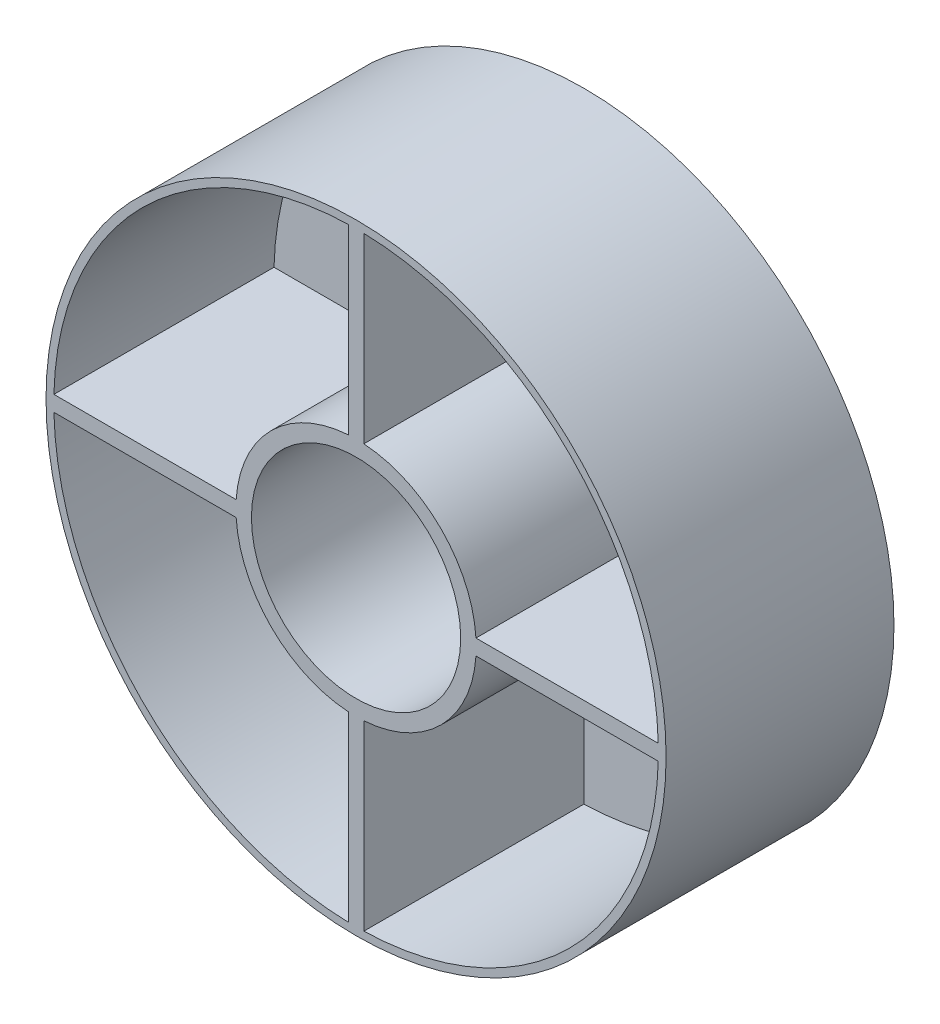
ISO-10303-21;
HEADER;
FILE_DESCRIPTION(('STEP AP214'),'2;1');
FILE_NAME('part.step','',(''),(''),'','','');
FILE_SCHEMA(('AUTOMOTIVE_DESIGN { 1 0 10303 214 1 1 1 1 }'));
ENDSEC;
DATA;
#1=APPLICATION_CONTEXT('core data for automotive mechanical design processes');
#2=APPLICATION_PROTOCOL_DEFINITION('international standard','automotive_design',2000,#1);
#3=PRODUCT_CONTEXT('',#1,'mechanical');
#4=PRODUCT('Part','Part','',(#3));
#5=PRODUCT_RELATED_PRODUCT_CATEGORY('part','',(#4));
#6=PRODUCT_DEFINITION_FORMATION('','',#4);
#7=PRODUCT_DEFINITION_CONTEXT('part definition',#1,'design');
#8=PRODUCT_DEFINITION('design','',#6,#7);
#9=PRODUCT_DEFINITION_SHAPE('','',#8);
#10=(LENGTH_UNIT() NAMED_UNIT(*) SI_UNIT(.MILLI.,.METRE.));
#11=(NAMED_UNIT(*) PLANE_ANGLE_UNIT() SI_UNIT($,.RADIAN.));
#12=(NAMED_UNIT(*) SI_UNIT($,.STERADIAN.) SOLID_ANGLE_UNIT());
#13=UNCERTAINTY_MEASURE_WITH_UNIT(LENGTH_MEASURE(1.E-05),#10,'distance_accuracy_value','');
#14=(GEOMETRIC_REPRESENTATION_CONTEXT(3) GLOBAL_UNCERTAINTY_ASSIGNED_CONTEXT((#13)) GLOBAL_UNIT_ASSIGNED_CONTEXT((#10,
#11,#12)) REPRESENTATION_CONTEXT('',''));
#15=CARTESIAN_POINT('',(0.,0.,0.));
#16=DIRECTION('',(0.,0.,1.));
#17=DIRECTION('',(1.,0.,0.));
#18=AXIS2_PLACEMENT_3D('',#15,#16,#17);
#19=CARTESIAN_POINT('',(0.,0.,5.));
#20=DIRECTION('',(0.,0.,1.));
#21=DIRECTION('',(1.,0.,0.));
#22=AXIS2_PLACEMENT_3D('',#19,#20,#21);
#23=PLANE('',#22);
#24=CARTESIAN_POINT('',(0.,0.,5.));
#25=DIRECTION('',(0.,0.,1.));
#26=DIRECTION('',(1.,0.,0.));
#27=AXIS2_PLACEMENT_3D('',#24,#25,#26);
#28=CIRCLE('',#27,25.);
#29=CARTESIAN_POINT('',(25.,0.,5.));
#30=VERTEX_POINT('',#29);
#31=EDGE_CURVE('E224',#30,#30,#28,.T.);
#32=ORIENTED_EDGE('',*,*,#31,.F.);
#33=EDGE_LOOP('',(#32));
#34=FACE_BOUND('',#33,.T.);
#35=CARTESIAN_POINT('',(0.,0.,5.));
#36=DIRECTION('',(0.,0.,1.));
#37=DIRECTION('',(1.,0.,0.));
#38=AXIS2_PLACEMENT_3D('',#35,#36,#37);
#39=CIRCLE('',#38,57.5);
#40=CARTESIAN_POINT('',(-57.5,0.,5.));
#41=VERTEX_POINT('',#40);
#42=EDGE_CURVE('E12',#41,#41,#39,.F.);
#43=ORIENTED_EDGE('',*,*,#42,.F.);
#44=EDGE_LOOP('',(#43));
#45=FACE_BOUND('',#44,.T.);
#46=ADVANCED_FACE('F45',(#34,#45),#23,.T.);
#47=CARTESIAN_POINT('',(0.,0.,147.));
#48=DIRECTION('',(0.,0.,-1.));
#49=DIRECTION('',(-1.,0.,0.));
#50=AXIS2_PLACEMENT_3D('',#47,#48,#49);
#51=CYLINDRICAL_SURFACE('',#50,77.5);
#52=DIRECTION('',(0.,0.,-1.));
#53=VECTOR('',#52,1.);
#54=CARTESIAN_POINT('',(77.3385414912901,5.,147.));
#55=LINE('',#54,#53);
#56=CARTESIAN_POINT('',(77.3385414912901,5.,5.));
#57=VERTEX_POINT('',#56);
#58=CARTESIAN_POINT('',(77.3385414912901,5.,147.));
#59=VERTEX_POINT('',#58);
#60=EDGE_CURVE('E60',#57,#59,#55,.F.);
#61=ORIENTED_EDGE('',*,*,#60,.F.);
#62=CARTESIAN_POINT('',(0.,0.,5.));
#63=DIRECTION('',(0.,0.,1.));
#64=DIRECTION('',(1.,0.,0.));
#65=AXIS2_PLACEMENT_3D('',#62,#63,#64);
#66=CIRCLE('',#65,77.5);
#67=CARTESIAN_POINT('',(5.,77.3385414912901,5.));
#68=VERTEX_POINT('',#67);
#69=EDGE_CURVE('E381',#57,#68,#66,.T.);
#70=ORIENTED_EDGE('',*,*,#69,.T.);
#71=DIRECTION('',(0.,0.,-1.));
#72=VECTOR('',#71,1.);
#73=CARTESIAN_POINT('',(5.,77.3385414912901,147.));
#74=LINE('',#73,#72);
#75=CARTESIAN_POINT('',(5.,77.3385414912901,147.));
#76=VERTEX_POINT('',#75);
#77=EDGE_CURVE('E295',#68,#76,#74,.F.);
#78=ORIENTED_EDGE('',*,*,#77,.T.);
#79=CARTESIAN_POINT('',(0.,0.,147.));
#80=DIRECTION('',(0.,0.,1.));
#81=DIRECTION('',(1.,0.,0.));
#82=AXIS2_PLACEMENT_3D('',#79,#80,#81);
#83=CIRCLE('',#82,77.5);
#84=EDGE_CURVE('E227',#59,#76,#83,.T.);
#85=ORIENTED_EDGE('',*,*,#84,.F.);
#86=EDGE_LOOP('',(#61,#70,#78,#85));
#87=FACE_BOUND('',#86,.T.);
#88=ADVANCED_FACE('F405',(#87),#51,.T.);
#89=CARTESIAN_POINT('',(0.,0.,5.));
#90=DIRECTION('',(0.,0.,1.));
#91=DIRECTION('',(1.,0.,0.));
#92=AXIS2_PLACEMENT_3D('',#89,#90,#91);
#93=PLANE('',#92);
#94=ORIENTED_EDGE('',*,*,#69,.F.);
#95=DIRECTION('',(1.,0.,0.));
#96=VECTOR('',#95,1.);
#97=CARTESIAN_POINT('',(0.,5.,5.));
#98=LINE('',#97,#96);
#99=CARTESIAN_POINT('',(194.935886896179,5.,5.));
#100=VERTEX_POINT('',#99);
#101=EDGE_CURVE('E260',#57,#100,#98,.T.);
#102=ORIENTED_EDGE('',*,*,#101,.T.);
#103=CARTESIAN_POINT('',(0.,0.,5.));
#104=DIRECTION('',(0.,0.,1.));
#105=DIRECTION('',(1.,0.,0.));
#106=AXIS2_PLACEMENT_3D('',#103,#104,#105);
#107=CIRCLE('',#106,195.);
#108=CARTESIAN_POINT('',(5.,194.935886896179,5.));
#109=VERTEX_POINT('',#108);
#110=EDGE_CURVE('E378',#109,#100,#107,.F.);
#111=ORIENTED_EDGE('',*,*,#110,.F.);
#112=DIRECTION('',(0.,1.,0.));
#113=VECTOR('',#112,1.);
#114=CARTESIAN_POINT('',(5.,0.,5.));
#115=LINE('',#114,#113);
#116=EDGE_CURVE('E218',#68,#109,#115,.T.);
#117=ORIENTED_EDGE('',*,*,#116,.F.);
#118=EDGE_LOOP('',(#94,#102,#111,#117));
#119=FACE_BOUND('',#118,.T.);
#120=ADVANCED_FACE('F402',(#119),#93,.T.);
#121=CARTESIAN_POINT('',(0.,0.,147.));
#122=DIRECTION('',(0.,0.,-1.));
#123=DIRECTION('',(-1.,0.,0.));
#124=AXIS2_PLACEMENT_3D('',#121,#122,#123);
#125=CYLINDRICAL_SURFACE('',#124,195.);
#126=CARTESIAN_POINT('',(0.,0.,147.));
#127=DIRECTION('',(0.,0.,1.));
#128=DIRECTION('',(1.,0.,0.));
#129=AXIS2_PLACEMENT_3D('',#126,#127,#128);
#130=CIRCLE('',#129,195.);
#131=CARTESIAN_POINT('',(5.,-194.935886896179,147.));
#132=VERTEX_POINT('',#131);
#133=CARTESIAN_POINT('',(194.935886896179,-5.,147.));
#134=VERTEX_POINT('',#133);
#135=EDGE_CURVE('E372',#132,#134,#130,.T.);
#136=ORIENTED_EDGE('',*,*,#135,.T.);
#137=DIRECTION('',(0.,0.,-1.));
#138=VECTOR('',#137,1.);
#139=CARTESIAN_POINT('',(194.935886896179,-5.,147.));
#140=LINE('',#139,#138);
#141=CARTESIAN_POINT('',(194.935886896179,-5.,5.));
#142=VERTEX_POINT('',#141);
#143=EDGE_CURVE('E250',#134,#142,#140,.T.);
#144=ORIENTED_EDGE('',*,*,#143,.T.);
#145=CARTESIAN_POINT('',(5.,-194.935886896179,5.));
#146=VERTEX_POINT('',#145);
#147=EDGE_CURVE('E382',#142,#146,#107,.F.);
#148=ORIENTED_EDGE('',*,*,#147,.T.);
#149=DIRECTION('',(0.,0.,-1.));
#150=VECTOR('',#149,1.);
#151=CARTESIAN_POINT('',(5.,-194.935886896179,147.));
#152=LINE('',#151,#150);
#153=EDGE_CURVE('E435',#132,#146,#152,.T.);
#154=ORIENTED_EDGE('',*,*,#153,.F.);
#155=EDGE_LOOP('',(#136,#144,#148,#154));
#156=FACE_BOUND('',#155,.T.);
#157=ADVANCED_FACE('F495',(#156),#125,.F.);
#158=CARTESIAN_POINT('',(-5.,194.935886896179,147.));
#159=VERTEX_POINT('',#158);
#160=CARTESIAN_POINT('',(-194.935886896179,5.,147.));
#161=VERTEX_POINT('',#160);
#162=EDGE_CURVE('E203',#159,#161,#130,.T.);
#163=ORIENTED_EDGE('',*,*,#162,.T.);
#164=DIRECTION('',(0.,0.,-1.));
#165=VECTOR('',#164,1.);
#166=CARTESIAN_POINT('',(-194.935886896179,5.,147.));
#167=LINE('',#166,#165);
#168=CARTESIAN_POINT('',(-194.935886896179,5.,5.));
#169=VERTEX_POINT('',#168);
#170=EDGE_CURVE('E273',#161,#169,#167,.T.);
#171=ORIENTED_EDGE('',*,*,#170,.T.);
#172=CARTESIAN_POINT('',(-5.,194.935886896179,5.));
#173=VERTEX_POINT('',#172);
#174=EDGE_CURVE('E375',#169,#173,#107,.F.);
#175=ORIENTED_EDGE('',*,*,#174,.T.);
#176=DIRECTION('',(0.,0.,-1.));
#177=VECTOR('',#176,1.);
#178=CARTESIAN_POINT('',(-5.,194.935886896179,147.));
#179=LINE('',#178,#177);
#180=EDGE_CURVE('E298',#173,#159,#179,.F.);
#181=ORIENTED_EDGE('',*,*,#180,.T.);
#182=EDGE_LOOP('',(#163,#171,#175,#181));
#183=FACE_BOUND('',#182,.T.);
#184=ADVANCED_FACE('F500',(#183),#125,.F.);
#185=DIRECTION('',(0.,0.,-1.));
#186=VECTOR('',#185,1.);
#187=CARTESIAN_POINT('',(-77.3385414912901,-5.,147.));
#188=LINE('',#187,#186);
#189=CARTESIAN_POINT('',(-77.3385414912901,-5.,5.));
#190=VERTEX_POINT('',#189);
#191=CARTESIAN_POINT('',(-77.3385414912901,-5.,147.));
#192=VERTEX_POINT('',#191);
#193=EDGE_CURVE('E270',#190,#192,#188,.F.);
#194=ORIENTED_EDGE('',*,*,#193,.F.);
#195=CARTESIAN_POINT('',(-5.,-77.3385414912901,5.));
#196=VERTEX_POINT('',#195);
#197=EDGE_CURVE('E385',#190,#196,#66,.T.);
#198=ORIENTED_EDGE('',*,*,#197,.T.);
#199=DIRECTION('',(0.,0.,-1.));
#200=VECTOR('',#199,1.);
#201=CARTESIAN_POINT('',(-5.,-77.3385414912901,147.));
#202=LINE('',#201,#200);
#203=CARTESIAN_POINT('',(-5.,-77.3385414912901,147.));
#204=VERTEX_POINT('',#203);
#205=EDGE_CURVE('E280',#196,#204,#202,.F.);
#206=ORIENTED_EDGE('',*,*,#205,.T.);
#207=EDGE_CURVE('E225',#192,#204,#83,.T.);
#208=ORIENTED_EDGE('',*,*,#207,.F.);
#209=EDGE_LOOP('',(#194,#198,#206,#208));
#210=FACE_BOUND('',#209,.T.);
#211=ADVANCED_FACE('F413',(#210),#51,.T.);
#212=ORIENTED_EDGE('',*,*,#197,.F.);
#213=DIRECTION('',(1.,0.,0.));
#214=VECTOR('',#213,1.);
#215=CARTESIAN_POINT('',(0.,-5.,5.));
#216=LINE('',#215,#214);
#217=CARTESIAN_POINT('',(-194.935886896179,-5.,5.));
#218=VERTEX_POINT('',#217);
#219=EDGE_CURVE('E431',#218,#190,#216,.T.);
#220=ORIENTED_EDGE('',*,*,#219,.F.);
#221=CARTESIAN_POINT('',(-5.,-194.935886896179,5.));
#222=VERTEX_POINT('',#221);
#223=EDGE_CURVE('E383',#222,#218,#107,.F.);
#224=ORIENTED_EDGE('',*,*,#223,.F.);
#225=DIRECTION('',(0.,1.,0.));
#226=VECTOR('',#225,1.);
#227=CARTESIAN_POINT('',(-5.,0.,5.));
#228=LINE('',#227,#226);
#229=EDGE_CURVE('E208',#222,#196,#228,.T.);
#230=ORIENTED_EDGE('',*,*,#229,.T.);
#231=EDGE_LOOP('',(#212,#220,#224,#230));
#232=FACE_BOUND('',#231,.T.);
#233=ADVANCED_FACE('F507',(#232),#93,.T.);
#234=CARTESIAN_POINT('',(5.,-77.3385414912901,5.));
#235=VERTEX_POINT('',#234);
#236=CARTESIAN_POINT('',(77.3385414912901,-5.,5.));
#237=VERTEX_POINT('',#236);
#238=EDGE_CURVE('E386',#235,#237,#66,.T.);
#239=ORIENTED_EDGE('',*,*,#238,.T.);
#240=DIRECTION('',(0.,0.,-1.));
#241=VECTOR('',#240,1.);
#242=CARTESIAN_POINT('',(77.3385414912901,-5.,147.));
#243=LINE('',#242,#241);
#244=CARTESIAN_POINT('',(77.3385414912901,-5.,147.));
#245=VERTEX_POINT('',#244);
#246=EDGE_CURVE('E249',#237,#245,#243,.F.);
#247=ORIENTED_EDGE('',*,*,#246,.T.);
#248=CARTESIAN_POINT('',(5.,-77.3385414912901,147.));
#249=VERTEX_POINT('',#248);
#250=EDGE_CURVE('E228',#249,#245,#83,.T.);
#251=ORIENTED_EDGE('',*,*,#250,.F.);
#252=DIRECTION('',(0.,0.,-1.));
#253=VECTOR('',#252,1.);
#254=CARTESIAN_POINT('',(5.,-77.3385414912901,147.));
#255=LINE('',#254,#253);
#256=EDGE_CURVE('E288',#235,#249,#255,.F.);
#257=ORIENTED_EDGE('',*,*,#256,.F.);
#258=EDGE_LOOP('',(#239,#247,#251,#257));
#259=FACE_BOUND('',#258,.T.);
#260=ADVANCED_FACE('F406',(#259),#51,.T.);
#261=DIRECTION('',(-1.,0.,0.));
#262=VECTOR('',#261,1.);
#263=CARTESIAN_POINT('',(0.,-5.,5.));
#264=LINE('',#263,#262);
#265=EDGE_CURVE('E68',#142,#237,#264,.T.);
#266=ORIENTED_EDGE('',*,*,#265,.T.);
#267=ORIENTED_EDGE('',*,*,#238,.F.);
#268=DIRECTION('',(0.,-1.,0.));
#269=VECTOR('',#268,1.);
#270=CARTESIAN_POINT('',(5.,0.,5.));
#271=LINE('',#270,#269);
#272=EDGE_CURVE('E285',#235,#146,#271,.T.);
#273=ORIENTED_EDGE('',*,*,#272,.T.);
#274=ORIENTED_EDGE('',*,*,#147,.F.);
#275=EDGE_LOOP('',(#266,#267,#273,#274));
#276=FACE_BOUND('',#275,.T.);
#277=ADVANCED_FACE('F403',(#276),#93,.T.);
#278=DIRECTION('',(0.,0.,-1.));
#279=VECTOR('',#278,1.);
#280=CARTESIAN_POINT('',(-194.935886896179,-5.,147.));
#281=LINE('',#280,#279);
#282=CARTESIAN_POINT('',(-194.935886896179,-5.,147.));
#283=VERTEX_POINT('',#282);
#284=EDGE_CURVE('E275',#283,#218,#281,.T.);
#285=ORIENTED_EDGE('',*,*,#284,.F.);
#286=CARTESIAN_POINT('',(-5.,-194.935886896179,147.));
#287=VERTEX_POINT('',#286);
#288=EDGE_CURVE('E370',#283,#287,#130,.T.);
#289=ORIENTED_EDGE('',*,*,#288,.T.);
#290=DIRECTION('',(0.,0.,-1.));
#291=VECTOR('',#290,1.);
#292=CARTESIAN_POINT('',(-5.,-194.935886896179,147.));
#293=LINE('',#292,#291);
#294=EDGE_CURVE('E230',#287,#222,#293,.T.);
#295=ORIENTED_EDGE('',*,*,#294,.T.);
#296=ORIENTED_EDGE('',*,*,#223,.T.);
#297=EDGE_LOOP('',(#285,#289,#295,#296));
#298=FACE_BOUND('',#297,.T.);
#299=ADVANCED_FACE('F422',(#298),#125,.F.);
#300=CARTESIAN_POINT('',(0.,0.,0.));
#301=DIRECTION('',(0.,0.,1.));
#302=DIRECTION('',(1.,0.,0.));
#303=AXIS2_PLACEMENT_3D('',#300,#301,#302);
#304=PLANE('',#303);
#305=CARTESIAN_POINT('',(0.,0.,0.));
#306=DIRECTION('',(0.,0.,-1.));
#307=DIRECTION('',(-1.,0.,0.));
#308=AXIS2_PLACEMENT_3D('',#305,#306,#307);
#309=CIRCLE('',#308,6.119);
#310=CARTESIAN_POINT('',(-6.119,0.,0.));
#311=VERTEX_POINT('',#310);
#312=EDGE_CURVE('E304',#311,#311,#309,.T.);
#313=ORIENTED_EDGE('',*,*,#312,.F.);
#314=EDGE_LOOP('',(#313));
#315=FACE_BOUND('',#314,.T.);
#316=CARTESIAN_POINT('',(0.,0.,0.));
#317=DIRECTION('',(0.,0.,1.));
#318=DIRECTION('',(1.,0.,0.));
#319=AXIS2_PLACEMENT_3D('',#316,#317,#318);
#320=CIRCLE('',#319,200.);
#321=CARTESIAN_POINT('',(200.,0.,0.));
#322=VERTEX_POINT('',#321);
#323=EDGE_CURVE('E367',#322,#322,#320,.T.);
#324=ORIENTED_EDGE('',*,*,#323,.F.);
#325=EDGE_LOOP('',(#324));
#326=FACE_BOUND('',#325,.T.);
#327=ADVANCED_FACE('F47',(#315,#326),#304,.F.);
#328=CARTESIAN_POINT('',(0.,0.,147.));
#329=DIRECTION('',(0.,0.,-1.));
#330=DIRECTION('',(-1.,0.,0.));
#331=AXIS2_PLACEMENT_3D('',#328,#329,#330);
#332=CYLINDRICAL_SURFACE('',#331,67.5);
#333=CARTESIAN_POINT('',(0.,0.,34.));
#334=DIRECTION('',(0.,0.,1.));
#335=DIRECTION('',(1.,0.,0.));
#336=AXIS2_PLACEMENT_3D('',#333,#334,#335);
#337=CIRCLE('',#336,67.5);
#338=CARTESIAN_POINT('',(67.5,0.,34.));
#339=VERTEX_POINT('',#338);
#340=EDGE_CURVE('E53',#339,#339,#337,.T.);
#341=ORIENTED_EDGE('',*,*,#340,.F.);
#342=EDGE_LOOP('',(#341));
#343=FACE_BOUND('',#342,.T.);
#344=CARTESIAN_POINT('',(0.,0.,147.));
#345=DIRECTION('',(0.,0.,1.));
#346=DIRECTION('',(1.,0.,0.));
#347=AXIS2_PLACEMENT_3D('',#344,#345,#346);
#348=CIRCLE('',#347,67.5);
#349=CARTESIAN_POINT('',(67.5,0.,147.));
#350=VERTEX_POINT('',#349);
#351=EDGE_CURVE('E233',#350,#350,#348,.T.);
#352=ORIENTED_EDGE('',*,*,#351,.T.);
#353=EDGE_LOOP('',(#352));
#354=FACE_BOUND('',#353,.T.);
#355=ADVANCED_FACE('F390',(#343,#354),#332,.F.);
#356=CARTESIAN_POINT('',(-5.,77.3385414912901,5.));
#357=VERTEX_POINT('',#356);
#358=CARTESIAN_POINT('',(-77.3385414912901,5.,5.));
#359=VERTEX_POINT('',#358);
#360=EDGE_CURVE('E384',#357,#359,#66,.T.);
#361=ORIENTED_EDGE('',*,*,#360,.T.);
#362=DIRECTION('',(0.,0.,-1.));
#363=VECTOR('',#362,1.);
#364=CARTESIAN_POINT('',(-77.3385414912901,5.,147.));
#365=LINE('',#364,#363);
#366=CARTESIAN_POINT('',(-77.3385414912901,5.,147.));
#367=VERTEX_POINT('',#366);
#368=EDGE_CURVE('E223',#359,#367,#365,.F.);
#369=ORIENTED_EDGE('',*,*,#368,.T.);
#370=CARTESIAN_POINT('',(-5.,77.3385414912901,147.));
#371=VERTEX_POINT('',#370);
#372=EDGE_CURVE('E202',#371,#367,#83,.T.);
#373=ORIENTED_EDGE('',*,*,#372,.F.);
#374=DIRECTION('',(0.,0.,-1.));
#375=VECTOR('',#374,1.);
#376=CARTESIAN_POINT('',(-5.,77.3385414912901,147.));
#377=LINE('',#376,#375);
#378=EDGE_CURVE('E211',#357,#371,#377,.F.);
#379=ORIENTED_EDGE('',*,*,#378,.F.);
#380=EDGE_LOOP('',(#361,#369,#373,#379));
#381=FACE_BOUND('',#380,.T.);
#382=ADVANCED_FACE('F221',(#381),#51,.T.);
#383=CARTESIAN_POINT('',(0.,0.,147.));
#384=DIRECTION('',(0.,0.,1.));
#385=DIRECTION('',(1.,0.,0.));
#386=AXIS2_PLACEMENT_3D('',#383,#384,#385);
#387=PLANE('',#386);
#388=CARTESIAN_POINT('',(194.935886896179,5.,147.));
#389=VERTEX_POINT('',#388);
#390=CARTESIAN_POINT('',(5.,194.935886896179,147.));
#391=VERTEX_POINT('',#390);
#392=EDGE_CURVE('E371',#389,#391,#130,.T.);
#393=ORIENTED_EDGE('',*,*,#392,.F.);
#394=DIRECTION('',(1.,0.,0.));
#395=VECTOR('',#394,1.);
#396=CARTESIAN_POINT('',(77.5,5.,147.));
#397=LINE('',#396,#395);
#398=EDGE_CURVE('E251',#389,#59,#397,.F.);
#399=ORIENTED_EDGE('',*,*,#398,.T.);
#400=ORIENTED_EDGE('',*,*,#84,.T.);
#401=DIRECTION('',(0.,1.,0.));
#402=VECTOR('',#401,1.);
#403=CARTESIAN_POINT('',(5.,77.5,147.));
#404=LINE('',#403,#402);
#405=EDGE_CURVE('E207',#391,#76,#404,.F.);
#406=ORIENTED_EDGE('',*,*,#405,.F.);
#407=EDGE_LOOP('',(#393,#399,#400,#406));
#408=FACE_BOUND('',#407,.T.);
#409=DIRECTION('',(1.,0.,0.));
#410=VECTOR('',#409,1.);
#411=CARTESIAN_POINT('',(-77.5,5.,147.));
#412=LINE('',#411,#410);
#413=EDGE_CURVE('E264',#367,#161,#412,.F.);
#414=ORIENTED_EDGE('',*,*,#413,.T.);
#415=ORIENTED_EDGE('',*,*,#162,.F.);
#416=DIRECTION('',(0.,1.,0.));
#417=VECTOR('',#416,1.);
#418=CARTESIAN_POINT('',(-5.,197.407054655144,147.));
#419=LINE('',#418,#417);
#420=EDGE_CURVE('E196',#159,#371,#419,.F.);
#421=ORIENTED_EDGE('',*,*,#420,.T.);
#422=ORIENTED_EDGE('',*,*,#372,.T.);
#423=EDGE_LOOP('',(#414,#415,#421,#422));
#424=FACE_BOUND('',#423,.T.);
#425=ORIENTED_EDGE('',*,*,#351,.F.);
#426=EDGE_LOOP('',(#425));
#427=FACE_BOUND('',#426,.T.);
#428=ORIENTED_EDGE('',*,*,#250,.T.);
#429=DIRECTION('',(1.,0.,0.));
#430=VECTOR('',#429,1.);
#431=CARTESIAN_POINT('',(77.5,-5.,147.));
#432=LINE('',#431,#430);
#433=EDGE_CURVE('E240',#134,#245,#432,.F.);
#434=ORIENTED_EDGE('',*,*,#433,.F.);
#435=ORIENTED_EDGE('',*,*,#135,.F.);
#436=DIRECTION('',(0.,-1.,0.));
#437=VECTOR('',#436,1.);
#438=CARTESIAN_POINT('',(5.,-77.5,147.));
#439=LINE('',#438,#437);
#440=EDGE_CURVE('E242',#132,#249,#439,.F.);
#441=ORIENTED_EDGE('',*,*,#440,.T.);
#442=EDGE_LOOP('',(#428,#434,#435,#441));
#443=FACE_BOUND('',#442,.T.);
#444=CARTESIAN_POINT('',(0.,0.,147.));
#445=DIRECTION('',(0.,0.,1.));
#446=DIRECTION('',(1.,0.,0.));
#447=AXIS2_PLACEMENT_3D('',#444,#445,#446);
#448=CIRCLE('',#447,200.);
#449=CARTESIAN_POINT('',(200.,0.,147.));
#450=VERTEX_POINT('',#449);
#451=EDGE_CURVE('E369',#450,#450,#448,.T.);
#452=ORIENTED_EDGE('',*,*,#451,.T.);
#453=EDGE_LOOP('',(#452));
#454=FACE_BOUND('',#453,.T.);
#455=ORIENTED_EDGE('',*,*,#288,.F.);
#456=DIRECTION('',(-1.,0.,0.));
#457=VECTOR('',#456,1.);
#458=CARTESIAN_POINT('',(-77.5,-5.,147.));
#459=LINE('',#458,#457);
#460=EDGE_CURVE('E265',#283,#192,#459,.F.);
#461=ORIENTED_EDGE('',*,*,#460,.T.);
#462=ORIENTED_EDGE('',*,*,#207,.T.);
#463=DIRECTION('',(0.,-1.,0.));
#464=VECTOR('',#463,1.);
#465=CARTESIAN_POINT('',(-5.,-77.5,147.));
#466=LINE('',#465,#464);
#467=EDGE_CURVE('E278',#287,#204,#466,.F.);
#468=ORIENTED_EDGE('',*,*,#467,.F.);
#469=EDGE_LOOP('',(#455,#461,#462,#468));
#470=FACE_BOUND('',#469,.T.);
#471=ADVANCED_FACE('F199',(#408,#424,#427,#443,#454,#470),#387,.T.);
#472=DIRECTION('',(1.,0.,0.));
#473=VECTOR('',#472,1.);
#474=CARTESIAN_POINT('',(0.,5.,5.));
#475=LINE('',#474,#473);
#476=EDGE_CURVE('E433',#169,#359,#475,.T.);
#477=ORIENTED_EDGE('',*,*,#476,.T.);
#478=ORIENTED_EDGE('',*,*,#360,.F.);
#479=DIRECTION('',(0.,1.,0.));
#480=VECTOR('',#479,1.);
#481=CARTESIAN_POINT('',(-5.,0.,5.));
#482=LINE('',#481,#480);
#483=EDGE_CURVE('E214',#357,#173,#482,.T.);
#484=ORIENTED_EDGE('',*,*,#483,.T.);
#485=ORIENTED_EDGE('',*,*,#174,.F.);
#486=EDGE_LOOP('',(#477,#478,#484,#485));
#487=FACE_BOUND('',#486,.T.);
#488=ADVANCED_FACE('F392',(#487),#93,.T.);
#489=DIRECTION('',(0.,0.,-1.));
#490=VECTOR('',#489,1.);
#491=CARTESIAN_POINT('',(194.935886896179,5.,147.));
#492=LINE('',#491,#490);
#493=EDGE_CURVE('E427',#389,#100,#492,.T.);
#494=ORIENTED_EDGE('',*,*,#493,.F.);
#495=ORIENTED_EDGE('',*,*,#392,.T.);
#496=DIRECTION('',(0.,0.,-1.));
#497=VECTOR('',#496,1.);
#498=CARTESIAN_POINT('',(5.,194.935886896179,147.));
#499=LINE('',#498,#497);
#500=EDGE_CURVE('E301',#109,#391,#499,.F.);
#501=ORIENTED_EDGE('',*,*,#500,.F.);
#502=ORIENTED_EDGE('',*,*,#110,.T.);
#503=EDGE_LOOP('',(#494,#495,#501,#502));
#504=FACE_BOUND('',#503,.T.);
#505=ADVANCED_FACE('F399',(#504),#125,.F.);
#506=CARTESIAN_POINT('',(0.,0.,147.));
#507=DIRECTION('',(0.,0.,-1.));
#508=DIRECTION('',(-1.,0.,0.));
#509=AXIS2_PLACEMENT_3D('',#506,#507,#508);
#510=CYLINDRICAL_SURFACE('',#509,200.);
#511=ORIENTED_EDGE('',*,*,#323,.T.);
#512=EDGE_LOOP('',(#511));
#513=FACE_BOUND('',#512,.T.);
#514=ORIENTED_EDGE('',*,*,#451,.F.);
#515=EDGE_LOOP('',(#514));
#516=FACE_BOUND('',#515,.T.);
#517=ADVANCED_FACE('F485',(#513,#516),#510,.T.);
#518=CARTESIAN_POINT('',(-2.5,0.,25.));
#519=DIRECTION('',(1.,0.,0.));
#520=DIRECTION('',(0.,1.,0.));
#521=AXIS2_PLACEMENT_3D('',#518,#519,#520);
#522=PLANE('',#521);
#523=DIRECTION('',(0.,-1.,0.));
#524=VECTOR('',#523,1.);
#525=CARTESIAN_POINT('',(-2.5,0.,7.));
#526=LINE('',#525,#524);
#527=CARTESIAN_POINT('',(-2.5,9.99999999999999,7.));
#528=VERTEX_POINT('',#527);
#529=CARTESIAN_POINT('',(-2.5,7.59934207678533,7.));
#530=VERTEX_POINT('',#529);
#531=EDGE_CURVE('E327',#528,#530,#526,.T.);
#532=ORIENTED_EDGE('',*,*,#531,.F.);
#533=DIRECTION('',(0.,0.,-1.));
#534=VECTOR('',#533,1.);
#535=CARTESIAN_POINT('',(-2.5,9.99999999999999,25.));
#536=LINE('',#535,#534);
#537=CARTESIAN_POINT('',(-2.5,9.99999999999999,25.));
#538=VERTEX_POINT('',#537);
#539=EDGE_CURVE('E364',#538,#528,#536,.T.);
#540=ORIENTED_EDGE('',*,*,#539,.F.);
#541=DIRECTION('',(0.,-1.,0.));
#542=VECTOR('',#541,1.);
#543=CARTESIAN_POINT('',(-2.5,0.,25.));
#544=LINE('',#543,#542);
#545=CARTESIAN_POINT('',(-2.5,7.59934207678533,25.));
#546=VERTEX_POINT('',#545);
#547=EDGE_CURVE('E333',#538,#546,#544,.T.);
#548=ORIENTED_EDGE('',*,*,#547,.T.);
#549=DIRECTION('',(0.,0.,-1.));
#550=VECTOR('',#549,1.);
#551=CARTESIAN_POINT('',(-2.5,7.59934207678533,25.));
#552=LINE('',#551,#550);
#553=EDGE_CURVE('E349',#546,#530,#552,.T.);
#554=ORIENTED_EDGE('',*,*,#553,.T.);
#555=EDGE_LOOP('',(#532,#540,#548,#554));
#556=FACE_BOUND('',#555,.T.);
#557=ADVANCED_FACE('F481',(#556),#522,.T.);
#558=CARTESIAN_POINT('',(-1.5,10.,25.));
#559=DIRECTION('',(0.,0.,-1.));
#560=DIRECTION('',(-1.,0.,0.));
#561=AXIS2_PLACEMENT_3D('',#558,#559,#560);
#562=CYLINDRICAL_SURFACE('',#561,1.);
#563=ORIENTED_EDGE('',*,*,#539,.T.);
#564=CARTESIAN_POINT('',(-1.5,10.,7.));
#565=DIRECTION('',(0.,0.,1.));
#566=DIRECTION('',(1.,0.,0.));
#567=AXIS2_PLACEMENT_3D('',#564,#565,#566);
#568=CIRCLE('',#567,1.);
#569=CARTESIAN_POINT('',(-1.49999999999999,11.,7.));
#570=VERTEX_POINT('',#569);
#571=EDGE_CURVE('E325',#528,#570,#568,.F.);
#572=ORIENTED_EDGE('',*,*,#571,.T.);
#573=DIRECTION('',(0.,0.,-1.));
#574=VECTOR('',#573,1.);
#575=CARTESIAN_POINT('',(-1.49999999999999,11.,25.));
#576=LINE('',#575,#574);
#577=CARTESIAN_POINT('',(-1.49999999999999,11.,25.));
#578=VERTEX_POINT('',#577);
#579=EDGE_CURVE('E361',#578,#570,#576,.T.);
#580=ORIENTED_EDGE('',*,*,#579,.F.);
#581=CARTESIAN_POINT('',(-1.5,10.,25.));
#582=DIRECTION('',(0.,0.,1.));
#583=DIRECTION('',(1.,0.,0.));
#584=AXIS2_PLACEMENT_3D('',#581,#582,#583);
#585=CIRCLE('',#584,1.);
#586=EDGE_CURVE('E336',#538,#578,#585,.F.);
#587=ORIENTED_EDGE('',*,*,#586,.F.);
#588=EDGE_LOOP('',(#563,#572,#580,#587));
#589=FACE_BOUND('',#588,.T.);
#590=ADVANCED_FACE('F477',(#589),#562,.F.);
#591=CARTESIAN_POINT('',(0.,11.,25.));
#592=DIRECTION('',(0.,-1.,0.));
#593=DIRECTION('',(0.,0.,-1.));
#594=AXIS2_PLACEMENT_3D('',#591,#592,#593);
#595=PLANE('',#594);
#596=DIRECTION('',(-1.,0.,0.));
#597=VECTOR('',#596,1.);
#598=CARTESIAN_POINT('',(0.,11.,7.));
#599=LINE('',#598,#597);
#600=CARTESIAN_POINT('',(1.49999999999999,11.,7.));
#601=VERTEX_POINT('',#600);
#602=EDGE_CURVE('E322',#601,#570,#599,.T.);
#603=ORIENTED_EDGE('',*,*,#602,.F.);
#604=DIRECTION('',(0.,0.,-1.));
#605=VECTOR('',#604,1.);
#606=CARTESIAN_POINT('',(1.49999999999999,11.,25.));
#607=LINE('',#606,#605);
#608=CARTESIAN_POINT('',(1.49999999999999,11.,25.));
#609=VERTEX_POINT('',#608);
#610=EDGE_CURVE('E358',#609,#601,#607,.T.);
#611=ORIENTED_EDGE('',*,*,#610,.F.);
#612=DIRECTION('',(-1.,0.,0.));
#613=VECTOR('',#612,1.);
#614=CARTESIAN_POINT('',(0.,11.,25.));
#615=LINE('',#614,#613);
#616=EDGE_CURVE('E338',#609,#578,#615,.T.);
#617=ORIENTED_EDGE('',*,*,#616,.T.);
#618=ORIENTED_EDGE('',*,*,#579,.T.);
#619=EDGE_LOOP('',(#603,#611,#617,#618));
#620=FACE_BOUND('',#619,.T.);
#621=ADVANCED_FACE('F473',(#620),#595,.T.);
#622=CARTESIAN_POINT('',(1.5,10.,25.));
#623=DIRECTION('',(0.,0.,-1.));
#624=DIRECTION('',(-1.,0.,0.));
#625=AXIS2_PLACEMENT_3D('',#622,#623,#624);
#626=CYLINDRICAL_SURFACE('',#625,1.);
#627=CARTESIAN_POINT('',(1.5,10.,7.));
#628=DIRECTION('',(0.,0.,1.));
#629=DIRECTION('',(1.,0.,0.));
#630=AXIS2_PLACEMENT_3D('',#627,#628,#629);
#631=CIRCLE('',#630,1.);
#632=CARTESIAN_POINT('',(2.5,9.99999999999999,7.));
#633=VERTEX_POINT('',#632);
#634=EDGE_CURVE('E319',#633,#601,#631,.T.);
#635=ORIENTED_EDGE('',*,*,#634,.F.);
#636=DIRECTION('',(0.,0.,-1.));
#637=VECTOR('',#636,1.);
#638=CARTESIAN_POINT('',(2.5,9.99999999999999,25.));
#639=LINE('',#638,#637);
#640=CARTESIAN_POINT('',(2.5,9.99999999999999,25.));
#641=VERTEX_POINT('',#640);
#642=EDGE_CURVE('E355',#641,#633,#639,.T.);
#643=ORIENTED_EDGE('',*,*,#642,.F.);
#644=CARTESIAN_POINT('',(1.5,10.,25.));
#645=DIRECTION('',(0.,0.,1.));
#646=DIRECTION('',(1.,0.,0.));
#647=AXIS2_PLACEMENT_3D('',#644,#645,#646);
#648=CIRCLE('',#647,1.);
#649=EDGE_CURVE('E341',#641,#609,#648,.T.);
#650=ORIENTED_EDGE('',*,*,#649,.T.);
#651=ORIENTED_EDGE('',*,*,#610,.T.);
#652=EDGE_LOOP('',(#635,#643,#650,#651));
#653=FACE_BOUND('',#652,.T.);
#654=ADVANCED_FACE('F469',(#653),#626,.F.);
#655=CARTESIAN_POINT('',(2.5,0.,25.));
#656=DIRECTION('',(1.,0.,0.));
#657=DIRECTION('',(0.,1.,0.));
#658=AXIS2_PLACEMENT_3D('',#655,#656,#657);
#659=PLANE('',#658);
#660=ORIENTED_EDGE('',*,*,#642,.T.);
#661=DIRECTION('',(0.,-1.,0.));
#662=VECTOR('',#661,1.);
#663=CARTESIAN_POINT('',(2.5,0.,7.));
#664=LINE('',#663,#662);
#665=CARTESIAN_POINT('',(2.5,7.59934207678533,7.));
#666=VERTEX_POINT('',#665);
#667=EDGE_CURVE('E316',#633,#666,#664,.T.);
#668=ORIENTED_EDGE('',*,*,#667,.T.);
#669=DIRECTION('',(0.,0.,-1.));
#670=VECTOR('',#669,1.);
#671=CARTESIAN_POINT('',(2.5,7.59934207678533,25.));
#672=LINE('',#671,#670);
#673=CARTESIAN_POINT('',(2.5,7.59934207678533,25.));
#674=VERTEX_POINT('',#673);
#675=EDGE_CURVE('E352',#674,#666,#672,.T.);
#676=ORIENTED_EDGE('',*,*,#675,.F.);
#677=DIRECTION('',(0.,-1.,0.));
#678=VECTOR('',#677,1.);
#679=CARTESIAN_POINT('',(2.5,0.,25.));
#680=LINE('',#679,#678);
#681=EDGE_CURVE('E344',#641,#674,#680,.T.);
#682=ORIENTED_EDGE('',*,*,#681,.F.);
#683=EDGE_LOOP('',(#660,#668,#676,#682));
#684=FACE_BOUND('',#683,.T.);
#685=ADVANCED_FACE('F466',(#684),#659,.F.);
#686=CARTESIAN_POINT('',(0.,0.,25.));
#687=DIRECTION('',(0.,0.,-1.));
#688=DIRECTION('',(-1.,0.,0.));
#689=AXIS2_PLACEMENT_3D('',#686,#687,#688);
#690=CYLINDRICAL_SURFACE('',#689,25.);
#691=ORIENTED_EDGE('',*,*,#31,.T.);
#692=EDGE_LOOP('',(#691));
#693=FACE_BOUND('',#692,.T.);
#694=CARTESIAN_POINT('',(0.,0.,25.));
#695=DIRECTION('',(0.,0.,1.));
#696=DIRECTION('',(1.,0.,0.));
#697=AXIS2_PLACEMENT_3D('',#694,#695,#696);
#698=CIRCLE('',#697,25.);
#699=CARTESIAN_POINT('',(25.,0.,25.));
#700=VERTEX_POINT('',#699);
#701=EDGE_CURVE('E330',#700,#700,#698,.T.);
#702=ORIENTED_EDGE('',*,*,#701,.F.);
#703=EDGE_LOOP('',(#702));
#704=FACE_BOUND('',#703,.T.);
#705=ADVANCED_FACE('F464',(#693,#704),#690,.T.);
#706=CARTESIAN_POINT('',(0.,0.,25.));
#707=DIRECTION('',(0.,0.,-1.));
#708=DIRECTION('',(-1.,0.,0.));
#709=AXIS2_PLACEMENT_3D('',#706,#707,#708);
#710=CYLINDRICAL_SURFACE('',#709,8.);
#711=CARTESIAN_POINT('',(0.,0.,25.));
#712=DIRECTION('',(0.,0.,1.));
#713=DIRECTION('',(1.,0.,0.));
#714=AXIS2_PLACEMENT_3D('',#711,#712,#713);
#715=CIRCLE('',#714,8.);
#716=EDGE_CURVE('E347',#546,#674,#715,.T.);
#717=ORIENTED_EDGE('',*,*,#716,.T.);
#718=ORIENTED_EDGE('',*,*,#675,.T.);
#719=CARTESIAN_POINT('',(0.,0.,7.));
#720=DIRECTION('',(0.,0.,1.));
#721=DIRECTION('',(1.,0.,0.));
#722=AXIS2_PLACEMENT_3D('',#719,#720,#721);
#723=CIRCLE('',#722,8.);
#724=EDGE_CURVE('E314',#530,#666,#723,.T.);
#725=ORIENTED_EDGE('',*,*,#724,.F.);
#726=ORIENTED_EDGE('',*,*,#553,.F.);
#727=EDGE_LOOP('',(#717,#718,#725,#726));
#728=FACE_BOUND('',#727,.T.);
#729=ADVANCED_FACE('F457',(#728),#710,.F.);
#730=CARTESIAN_POINT('',(0.,0.,25.));
#731=DIRECTION('',(0.,0.,1.));
#732=DIRECTION('',(1.,0.,0.));
#733=AXIS2_PLACEMENT_3D('',#730,#731,#732);
#734=PLANE('',#733);
#735=ORIENTED_EDGE('',*,*,#681,.T.);
#736=ORIENTED_EDGE('',*,*,#716,.F.);
#737=ORIENTED_EDGE('',*,*,#547,.F.);
#738=ORIENTED_EDGE('',*,*,#586,.T.);
#739=ORIENTED_EDGE('',*,*,#616,.F.);
#740=ORIENTED_EDGE('',*,*,#649,.F.);
#741=EDGE_LOOP('',(#735,#736,#737,#738,#739,#740));
#742=FACE_BOUND('',#741,.T.);
#743=ORIENTED_EDGE('',*,*,#701,.T.);
#744=EDGE_LOOP('',(#743));
#745=FACE_BOUND('',#744,.T.);
#746=ADVANCED_FACE('F448',(#742,#745),#734,.T.);
#747=CARTESIAN_POINT('',(0.,0.,7.));
#748=DIRECTION('',(0.,0.,1.));
#749=DIRECTION('',(1.,0.,0.));
#750=AXIS2_PLACEMENT_3D('',#747,#748,#749);
#751=PLANE('',#750);
#752=ORIENTED_EDGE('',*,*,#724,.T.);
#753=ORIENTED_EDGE('',*,*,#667,.F.);
#754=ORIENTED_EDGE('',*,*,#634,.T.);
#755=ORIENTED_EDGE('',*,*,#602,.T.);
#756=ORIENTED_EDGE('',*,*,#571,.F.);
#757=ORIENTED_EDGE('',*,*,#531,.T.);
#758=EDGE_LOOP('',(#752,#753,#754,#755,#756,#757));
#759=FACE_BOUND('',#758,.T.);
#760=CARTESIAN_POINT('',(0.,0.,7.));
#761=DIRECTION('',(0.,0.,1.));
#762=DIRECTION('',(1.,0.,0.));
#763=AXIS2_PLACEMENT_3D('',#760,#761,#762);
#764=CIRCLE('',#763,2.89999999999998);
#765=CARTESIAN_POINT('',(2.89999999999998,0.,7.));
#766=VERTEX_POINT('',#765);
#767=EDGE_CURVE('E313',#766,#766,#764,.T.);
#768=ORIENTED_EDGE('',*,*,#767,.F.);
#769=EDGE_LOOP('',(#768));
#770=FACE_BOUND('',#769,.T.);
#771=ADVANCED_FACE('F446',(#759,#770),#751,.T.);
#772=CARTESIAN_POINT('',(0.,0.,0.));
#773=DIRECTION('',(0.,0.,-1.));
#774=DIRECTION('',(-1.,0.,0.));
#775=AXIS2_PLACEMENT_3D('',#772,#773,#774);
#776=CYLINDRICAL_SURFACE('',#775,2.89999999999998);
#777=ORIENTED_EDGE('',*,*,#767,.T.);
#778=EDGE_LOOP('',(#777));
#779=FACE_BOUND('',#778,.T.);
#780=CARTESIAN_POINT('',(0.,0.,3.5));
#781=DIRECTION('',(0.,0.,-1.));
#782=DIRECTION('',(-1.,0.,0.));
#783=AXIS2_PLACEMENT_3D('',#780,#781,#782);
#784=CIRCLE('',#783,2.9);
#785=CARTESIAN_POINT('',(-2.9,0.,3.5));
#786=VERTEX_POINT('',#785);
#787=EDGE_CURVE('E310',#786,#786,#784,.T.);
#788=ORIENTED_EDGE('',*,*,#787,.T.);
#789=EDGE_LOOP('',(#788));
#790=FACE_BOUND('',#789,.T.);
#791=ADVANCED_FACE('F443',(#779,#790),#776,.F.);
#792=CARTESIAN_POINT('',(2.9,0.,3.5));
#793=DIRECTION('',(0.,0.,1.));
#794=DIRECTION('',(1.,0.,0.));
#795=AXIS2_PLACEMENT_3D('',#792,#793,#794);
#796=PLANE('',#795);
#797=CARTESIAN_POINT('',(0.,0.,3.5));
#798=DIRECTION('',(0.,0.,-1.));
#799=DIRECTION('',(-1.,0.,0.));
#800=AXIS2_PLACEMENT_3D('',#797,#798,#799);
#801=CIRCLE('',#800,6.119);
#802=CARTESIAN_POINT('',(-6.119,0.,3.5));
#803=VERTEX_POINT('',#802);
#804=EDGE_CURVE('E307',#803,#803,#801,.T.);
#805=ORIENTED_EDGE('',*,*,#804,.T.);
#806=EDGE_LOOP('',(#805));
#807=FACE_BOUND('',#806,.T.);
#808=ORIENTED_EDGE('',*,*,#787,.F.);
#809=EDGE_LOOP('',(#808));
#810=FACE_BOUND('',#809,.T.);
#811=ADVANCED_FACE('F455',(#807,#810),#796,.F.);
#812=CARTESIAN_POINT('',(0.,0.,0.));
#813=DIRECTION('',(0.,0.,-1.));
#814=DIRECTION('',(-1.,0.,0.));
#815=AXIS2_PLACEMENT_3D('',#812,#813,#814);
#816=CYLINDRICAL_SURFACE('',#815,6.119);
#817=ORIENTED_EDGE('',*,*,#804,.F.);
#818=EDGE_LOOP('',(#817));
#819=FACE_BOUND('',#818,.T.);
#820=ORIENTED_EDGE('',*,*,#312,.T.);
#821=EDGE_LOOP('',(#820));
#822=FACE_BOUND('',#821,.T.);
#823=ADVANCED_FACE('F560',(#819,#822),#816,.F.);
#824=CARTESIAN_POINT('',(5.,77.5,147.));
#825=DIRECTION('',(1.,0.,0.));
#826=DIRECTION('',(0.,1.,0.));
#827=AXIS2_PLACEMENT_3D('',#824,#825,#826);
#828=PLANE('',#827);
#829=ORIENTED_EDGE('',*,*,#77,.F.);
#830=ORIENTED_EDGE('',*,*,#116,.T.);
#831=ORIENTED_EDGE('',*,*,#500,.T.);
#832=ORIENTED_EDGE('',*,*,#405,.T.);
#833=EDGE_LOOP('',(#829,#830,#831,#832));
#834=FACE_BOUND('',#833,.T.);
#835=ADVANCED_FACE('F530',(#834),#828,.T.);
#836=CARTESIAN_POINT('',(-5.,77.5,147.));
#837=DIRECTION('',(1.,0.,0.));
#838=DIRECTION('',(0.,1.,0.));
#839=AXIS2_PLACEMENT_3D('',#836,#837,#838);
#840=PLANE('',#839);
#841=ORIENTED_EDGE('',*,*,#483,.F.);
#842=ORIENTED_EDGE('',*,*,#378,.T.);
#843=ORIENTED_EDGE('',*,*,#420,.F.);
#844=ORIENTED_EDGE('',*,*,#180,.F.);
#845=EDGE_LOOP('',(#841,#842,#843,#844));
#846=FACE_BOUND('',#845,.T.);
#847=ADVANCED_FACE('F212',(#846),#840,.F.);
#848=CARTESIAN_POINT('',(5.,-77.5,147.));
#849=DIRECTION('',(-1.,0.,0.));
#850=DIRECTION('',(0.,-1.,0.));
#851=AXIS2_PLACEMENT_3D('',#848,#849,#850);
#852=PLANE('',#851);
#853=ORIENTED_EDGE('',*,*,#272,.F.);
#854=ORIENTED_EDGE('',*,*,#256,.T.);
#855=ORIENTED_EDGE('',*,*,#440,.F.);
#856=ORIENTED_EDGE('',*,*,#153,.T.);
#857=EDGE_LOOP('',(#853,#854,#855,#856));
#858=FACE_BOUND('',#857,.T.);
#859=ADVANCED_FACE('F524',(#858),#852,.F.);
#860=CARTESIAN_POINT('',(-5.,-77.5,147.));
#861=DIRECTION('',(-1.,0.,0.));
#862=DIRECTION('',(0.,-1.,0.));
#863=AXIS2_PLACEMENT_3D('',#860,#861,#862);
#864=PLANE('',#863);
#865=ORIENTED_EDGE('',*,*,#205,.F.);
#866=ORIENTED_EDGE('',*,*,#229,.F.);
#867=ORIENTED_EDGE('',*,*,#294,.F.);
#868=ORIENTED_EDGE('',*,*,#467,.T.);
#869=EDGE_LOOP('',(#865,#866,#867,#868));
#870=FACE_BOUND('',#869,.T.);
#871=ADVANCED_FACE('F550',(#870),#864,.T.);
#872=CARTESIAN_POINT('',(-77.5,-5.,147.));
#873=DIRECTION('',(0.,1.,0.));
#874=DIRECTION('',(-1.,0.,0.));
#875=AXIS2_PLACEMENT_3D('',#872,#873,#874);
#876=PLANE('',#875);
#877=ORIENTED_EDGE('',*,*,#219,.T.);
#878=ORIENTED_EDGE('',*,*,#193,.T.);
#879=ORIENTED_EDGE('',*,*,#460,.F.);
#880=ORIENTED_EDGE('',*,*,#284,.T.);
#881=EDGE_LOOP('',(#877,#878,#879,#880));
#882=FACE_BOUND('',#881,.T.);
#883=ADVANCED_FACE('F544',(#882),#876,.F.);
#884=CARTESIAN_POINT('',(-77.5,5.,147.));
#885=DIRECTION('',(0.,1.,0.));
#886=DIRECTION('',(-1.,0.,0.));
#887=AXIS2_PLACEMENT_3D('',#884,#885,#886);
#888=PLANE('',#887);
#889=ORIENTED_EDGE('',*,*,#368,.F.);
#890=ORIENTED_EDGE('',*,*,#476,.F.);
#891=ORIENTED_EDGE('',*,*,#170,.F.);
#892=ORIENTED_EDGE('',*,*,#413,.F.);
#893=EDGE_LOOP('',(#889,#890,#891,#892));
#894=FACE_BOUND('',#893,.T.);
#895=ADVANCED_FACE('F519',(#894),#888,.T.);
#896=CARTESIAN_POINT('',(77.5,5.,147.));
#897=DIRECTION('',(0.,-1.,0.));
#898=DIRECTION('',(1.,0.,0.));
#899=AXIS2_PLACEMENT_3D('',#896,#897,#898);
#900=PLANE('',#899);
#901=ORIENTED_EDGE('',*,*,#101,.F.);
#902=ORIENTED_EDGE('',*,*,#60,.T.);
#903=ORIENTED_EDGE('',*,*,#398,.F.);
#904=ORIENTED_EDGE('',*,*,#493,.T.);
#905=EDGE_LOOP('',(#901,#902,#903,#904));
#906=FACE_BOUND('',#905,.T.);
#907=ADVANCED_FACE('F535',(#906),#900,.F.);
#908=CARTESIAN_POINT('',(77.5,-5.,147.));
#909=DIRECTION('',(0.,-1.,0.));
#910=DIRECTION('',(1.,0.,0.));
#911=AXIS2_PLACEMENT_3D('',#908,#909,#910);
#912=PLANE('',#911);
#913=ORIENTED_EDGE('',*,*,#246,.F.);
#914=ORIENTED_EDGE('',*,*,#265,.F.);
#915=ORIENTED_EDGE('',*,*,#143,.F.);
#916=ORIENTED_EDGE('',*,*,#433,.T.);
#917=EDGE_LOOP('',(#913,#914,#915,#916));
#918=FACE_BOUND('',#917,.T.);
#919=ADVANCED_FACE('F248',(#918),#912,.T.);
#920=CARTESIAN_POINT('',(0.,0.,34.));
#921=DIRECTION('',(0.,0.,1.));
#922=DIRECTION('',(1.,0.,0.));
#923=AXIS2_PLACEMENT_3D('',#920,#921,#922);
#924=PLANE('',#923);
#925=CARTESIAN_POINT('',(0.,0.,34.));
#926=DIRECTION('',(0.,0.,1.));
#927=DIRECTION('',(1.,0.,0.));
#928=AXIS2_PLACEMENT_3D('',#925,#926,#927);
#929=CIRCLE('',#928,57.5);
#930=CARTESIAN_POINT('',(-57.5,0.,34.));
#931=VERTEX_POINT('',#930);
#932=EDGE_CURVE('E252',#931,#931,#929,.T.);
#933=ORIENTED_EDGE('',*,*,#932,.F.);
#934=EDGE_LOOP('',(#933));
#935=FACE_BOUND('',#934,.T.);
#936=ORIENTED_EDGE('',*,*,#340,.T.);
#937=EDGE_LOOP('',(#936));
#938=FACE_BOUND('',#937,.T.);
#939=ADVANCED_FACE('F542',(#935,#938),#924,.T.);
#940=CARTESIAN_POINT('',(0.,0.,34.));
#941=DIRECTION('',(0.,0.,-1.));
#942=DIRECTION('',(-1.,0.,0.));
#943=AXIS2_PLACEMENT_3D('',#940,#941,#942);
#944=CYLINDRICAL_SURFACE('',#943,57.5);
#945=CARTESIAN_POINT('',(-57.5,0.,34.));
#946=CARTESIAN_POINT('',(-57.5,0.,33.6979166666667));
#947=CARTESIAN_POINT('',(-57.5,0.,33.3958333333333));
#948=CARTESIAN_POINT('',(-57.5,0.,32.7916666666667));
#949=CARTESIAN_POINT('',(-57.5,0.,32.4895833333333));
#950=CARTESIAN_POINT('',(-57.5,0.,31.8854166666667));
#951=CARTESIAN_POINT('',(-57.5,0.,31.5833333333333));
#952=CARTESIAN_POINT('',(-57.5,0.,30.9791666666667));
#953=CARTESIAN_POINT('',(-57.5,0.,30.6770833333333));
#954=CARTESIAN_POINT('',(-57.5,0.,30.0729166666667));
#955=CARTESIAN_POINT('',(-57.5,0.,29.7708333333333));
#956=CARTESIAN_POINT('',(-57.5,0.,29.1666666666667));
#957=CARTESIAN_POINT('',(-57.5,0.,28.8645833333333));
#958=CARTESIAN_POINT('',(-57.5,0.,28.2604166666667));
#959=CARTESIAN_POINT('',(-57.5,0.,27.9583333333333));
#960=CARTESIAN_POINT('',(-57.5,0.,27.3541666666667));
#961=CARTESIAN_POINT('',(-57.5,0.,27.0520833333333));
#962=CARTESIAN_POINT('',(-57.5,0.,26.4479166666667));
#963=CARTESIAN_POINT('',(-57.5,0.,26.1458333333333));
#964=CARTESIAN_POINT('',(-57.5,0.,25.5416666666667));
#965=CARTESIAN_POINT('',(-57.5,0.,25.2395833333333));
#966=CARTESIAN_POINT('',(-57.5,0.,24.6354166666667));
#967=CARTESIAN_POINT('',(-57.5,0.,24.3333333333333));
#968=CARTESIAN_POINT('',(-57.5,0.,23.7291666666667));
#969=CARTESIAN_POINT('',(-57.5,0.,23.4270833333333));
#970=CARTESIAN_POINT('',(-57.5,0.,22.8229166666667));
#971=CARTESIAN_POINT('',(-57.5,0.,22.5208333333333));
#972=CARTESIAN_POINT('',(-57.5,0.,21.9166666666667));
#973=CARTESIAN_POINT('',(-57.5,0.,21.6145833333333));
#974=CARTESIAN_POINT('',(-57.5,0.,21.0104166666667));
#975=CARTESIAN_POINT('',(-57.5,0.,20.7083333333333));
#976=CARTESIAN_POINT('',(-57.5,0.,20.1041666666667));
#977=CARTESIAN_POINT('',(-57.5,0.,19.8020833333333));
#978=CARTESIAN_POINT('',(-57.5,0.,19.1979166666667));
#979=CARTESIAN_POINT('',(-57.5,0.,18.8958333333333));
#980=CARTESIAN_POINT('',(-57.5,0.,18.2916666666667));
#981=CARTESIAN_POINT('',(-57.5,0.,17.9895833333333));
#982=CARTESIAN_POINT('',(-57.5,0.,17.3854166666667));
#983=CARTESIAN_POINT('',(-57.5,0.,17.0833333333333));
#984=CARTESIAN_POINT('',(-57.5,0.,16.4791666666667));
#985=CARTESIAN_POINT('',(-57.5,0.,16.1770833333333));
#986=CARTESIAN_POINT('',(-57.5,0.,15.5729166666667));
#987=CARTESIAN_POINT('',(-57.5,0.,15.2708333333333));
#988=CARTESIAN_POINT('',(-57.5,0.,14.6666666666667));
#989=CARTESIAN_POINT('',(-57.5,0.,14.3645833333333));
#990=CARTESIAN_POINT('',(-57.5,0.,13.7604166666667));
#991=CARTESIAN_POINT('',(-57.5,0.,13.4583333333333));
#992=CARTESIAN_POINT('',(-57.5,0.,12.8541666666667));
#993=CARTESIAN_POINT('',(-57.5,0.,12.5520833333333));
#994=CARTESIAN_POINT('',(-57.5,0.,11.9479166666667));
#995=CARTESIAN_POINT('',(-57.5,0.,11.6458333333333));
#996=CARTESIAN_POINT('',(-57.5,0.,11.0416666666667));
#997=CARTESIAN_POINT('',(-57.5,0.,10.7395833333333));
#998=CARTESIAN_POINT('',(-57.5,0.,10.1354166666667));
#999=CARTESIAN_POINT('',(-57.5,0.,9.83333333333333));
#1000=CARTESIAN_POINT('',(-57.5,0.,9.22916666666667));
#1001=CARTESIAN_POINT('',(-57.5,0.,8.92708333333333));
#1002=CARTESIAN_POINT('',(-57.5,0.,8.32291666666667));
#1003=CARTESIAN_POINT('',(-57.5,0.,8.02083333333333));
#1004=CARTESIAN_POINT('',(-57.5,0.,7.41666666666667));
#1005=CARTESIAN_POINT('',(-57.5,0.,7.11458333333333));
#1006=CARTESIAN_POINT('',(-57.5,0.,6.51041666666667));
#1007=CARTESIAN_POINT('',(-57.5,0.,6.20833333333334));
#1008=CARTESIAN_POINT('',(-57.5,0.,5.60416666666667));
#1009=CARTESIAN_POINT('',(-57.5,0.,5.30208333333333));
#1010=CARTESIAN_POINT('',(-57.5,0.,5.));
#1011=B_SPLINE_CURVE_WITH_KNOTS('',3,(#945,#946,#947,#948,#949,#950,#951,#952,#953,#954,#955,
#956,#957,#958,#959,#960,#961,#962,#963,#964,#965,#966,#967,#968,#969,#970,#971,#972,#973,#974,
#975,#976,#977,#978,#979,#980,#981,#982,#983,#984,#985,#986,#987,#988,#989,#990,#991,#992,#993,
#994,#995,#996,#997,#998,#999,#1000,#1001,#1002,#1003,#1004,#1005,#1006,#1007,#1008,#1009,
#1010),.UNSPECIFIED.,.F.,.F.,(4,2,2,2,2,2,2,2,2,2,2,2,2,2,2,2,2,2,2,2,2,2,2,2,2,2,2,2,2,2,2,2,
4),(0.,0.906250000000004,1.8125,2.71875000000001,3.625,4.53125,5.4375,6.34375,7.25,8.15625,
9.0625,9.96875,10.875,11.78125,12.6875,13.59375,14.5,15.40625,16.3125,17.21875,18.125,19.03125,
19.9375,20.84375,21.75,22.65625,23.5625,24.46875,25.375,26.28125,27.1875,28.09375,29.),.UNSPECIFIED.);
#1012=EDGE_CURVE('BSEAM776',#931,#41,#1011,.T.);
#1013=ORIENTED_EDGE('',*,*,#932,.T.);
#1014=ORIENTED_EDGE('',*,*,#42,.T.);
#1015=ORIENTED_EDGE('',*,*,#1012,.T.);
#1016=ORIENTED_EDGE('',*,*,#1012,.F.);
#1017=EDGE_LOOP('',(#1013,#1015,#1014,#1016));
#1018=FACE_BOUND('',#1017,.T.);
#1019=ADVANCED_FACE('F776',(#1018),#944,.F.);
#1020=CLOSED_SHELL('',(#46,#88,#120,#157,#184,#211,#233,#260,#277,#299,#327,#355,#382,#471,#488,
#505,#517,#557,#590,#621,#654,#685,#705,#729,#746,#771,#791,#811,#823,#835,#847,#859,#871,#883,
#895,#907,#919,#939,#1019));
#1021=MANIFOLD_SOLID_BREP('B2',#1020);
#1022=ADVANCED_BREP_SHAPE_REPRESENTATION('',(#18,#1021),#14);
#1023=SHAPE_DEFINITION_REPRESENTATION(#9,#1022);
ENDSEC;
END-ISO-10303-21;
